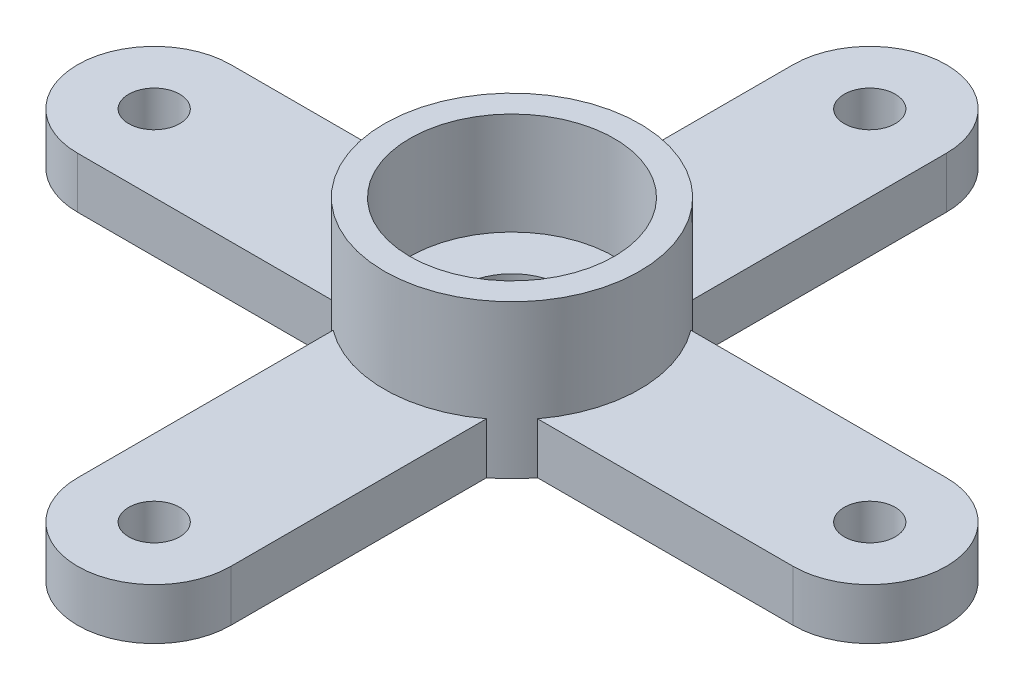
ISO-10303-21;
HEADER;
FILE_DESCRIPTION(('STEP AP214'),'2;1');
FILE_NAME('part.step','',(''),(''),'','','');
FILE_SCHEMA(('AUTOMOTIVE_DESIGN { 1 0 10303 214 1 1 1 1 }'));
ENDSEC;
DATA;
#1=APPLICATION_CONTEXT('core data for automotive mechanical design processes');
#2=APPLICATION_PROTOCOL_DEFINITION('international standard','automotive_design',2000,#1);
#3=PRODUCT_CONTEXT('',#1,'mechanical');
#4=PRODUCT('Part','Part','',(#3));
#5=PRODUCT_RELATED_PRODUCT_CATEGORY('part','',(#4));
#6=PRODUCT_DEFINITION_FORMATION('','',#4);
#7=PRODUCT_DEFINITION_CONTEXT('part definition',#1,'design');
#8=PRODUCT_DEFINITION('design','',#6,#7);
#9=PRODUCT_DEFINITION_SHAPE('','',#8);
#10=(LENGTH_UNIT() NAMED_UNIT(*) SI_UNIT(.MILLI.,.METRE.));
#11=(NAMED_UNIT(*) PLANE_ANGLE_UNIT() SI_UNIT($,.RADIAN.));
#12=(NAMED_UNIT(*) SI_UNIT($,.STERADIAN.) SOLID_ANGLE_UNIT());
#13=UNCERTAINTY_MEASURE_WITH_UNIT(LENGTH_MEASURE(1.E-05),#10,'distance_accuracy_value','');
#14=(GEOMETRIC_REPRESENTATION_CONTEXT(3) GLOBAL_UNCERTAINTY_ASSIGNED_CONTEXT((#13)) GLOBAL_UNIT_ASSIGNED_CONTEXT((#10,
#11,#12)) REPRESENTATION_CONTEXT('',''));
#15=CARTESIAN_POINT('',(0.,0.,0.));
#16=DIRECTION('',(0.,0.,1.));
#17=DIRECTION('',(1.,0.,0.));
#18=AXIS2_PLACEMENT_3D('',#15,#16,#17);
#19=CARTESIAN_POINT('',(0.,1.,0.));
#20=DIRECTION('',(0.,1.,0.));
#21=DIRECTION('',(0.,0.,1.));
#22=AXIS2_PLACEMENT_3D('',#19,#20,#21);
#23=PLANE('',#22);
#24=CARTESIAN_POINT('',(-6.99999999999975,1.,3.38694649705886E-13));
#25=DIRECTION('',(0.,1.,0.));
#26=DIRECTION('',(0.,0.,1.));
#27=AXIS2_PLACEMENT_3D('',#24,#25,#26);
#28=CIRCLE('',#27,0.500000000000129);
#29=CARTESIAN_POINT('',(-6.99999999999975,1.,0.500000000000468));
#30=VERTEX_POINT('',#29);
#31=EDGE_CURVE('E190',#30,#30,#28,.T.);
#32=ORIENTED_EDGE('',*,*,#31,.F.);
#33=EDGE_LOOP('',(#32));
#34=FACE_BOUND('',#33,.T.);
#35=DIRECTION('',(1.,0.,0.));
#36=VECTOR('',#35,1.);
#37=CARTESIAN_POINT('',(0.,1.,1.50000000000034));
#38=LINE('',#37,#36);
#39=CARTESIAN_POINT('',(-6.99999999999975,1.,1.5000000000004));
#40=VERTEX_POINT('',#39);
#41=CARTESIAN_POINT('',(-1.99999999999975,1.,1.50000000000034));
#42=VERTEX_POINT('',#41);
#43=EDGE_CURVE('E316',#40,#42,#38,.T.);
#44=ORIENTED_EDGE('',*,*,#43,.T.);
#45=CARTESIAN_POINT('',(0.,1.,0.));
#46=DIRECTION('',(0.,1.,0.));
#47=DIRECTION('',(0.,0.,1.));
#48=AXIS2_PLACEMENT_3D('',#45,#46,#47);
#49=CIRCLE('',#48,2.5);
#50=CARTESIAN_POINT('',(-2.00000000000007,1.,-1.49999999999991));
#51=VERTEX_POINT('',#50);
#52=EDGE_CURVE('E204',#42,#51,#49,.F.);
#53=ORIENTED_EDGE('',*,*,#52,.T.);
#54=DIRECTION('',(-1.,0.,0.));
#55=VECTOR('',#54,1.);
#56=CARTESIAN_POINT('',(0.,1.,-1.49999999999966));
#57=LINE('',#56,#55);
#58=CARTESIAN_POINT('',(-6.99999999999975,1.,-1.49999999999973));
#59=VERTEX_POINT('',#58);
#60=EDGE_CURVE('E308',#51,#59,#57,.T.);
#61=ORIENTED_EDGE('',*,*,#60,.T.);
#62=CARTESIAN_POINT('',(-6.99999999999975,1.,3.38694649705886E-13));
#63=DIRECTION('',(0.,1.,0.));
#64=DIRECTION('',(0.,0.,1.));
#65=AXIS2_PLACEMENT_3D('',#62,#63,#64);
#66=CIRCLE('',#65,1.50000000000013);
#67=EDGE_CURVE('E310',#59,#40,#66,.T.);
#68=ORIENTED_EDGE('',*,*,#67,.T.);
#69=EDGE_LOOP('',(#44,#53,#61,#68));
#70=FACE_BOUND('',#69,.T.);
#71=ADVANCED_FACE('F41',(#34,#70),#23,.T.);
#72=CARTESIAN_POINT('',(0.,1.,-6.9999999999997));
#73=DIRECTION('',(0.,1.,0.));
#74=DIRECTION('',(0.,0.,1.));
#75=AXIS2_PLACEMENT_3D('',#72,#73,#74);
#76=CIRCLE('',#75,0.50000000000025);
#77=CARTESIAN_POINT('',(0.,1.,-6.49999999999945));
#78=VERTEX_POINT('',#77);
#79=EDGE_CURVE('E184',#78,#78,#76,.T.);
#80=ORIENTED_EDGE('',*,*,#79,.F.);
#81=EDGE_LOOP('',(#80));
#82=FACE_BOUND('',#81,.T.);
#83=DIRECTION('',(0.,0.,1.));
#84=VECTOR('',#83,1.);
#85=CARTESIAN_POINT('',(-1.50000000000004,1.,0.));
#86=LINE('',#85,#84);
#87=CARTESIAN_POINT('',(-1.50000000000017,1.,-6.9999999999997));
#88=VERTEX_POINT('',#87);
#89=CARTESIAN_POINT('',(-1.50000000000017,1.,-1.99999999999987));
#90=VERTEX_POINT('',#89);
#91=EDGE_CURVE('E306',#88,#90,#86,.T.);
#92=ORIENTED_EDGE('',*,*,#91,.T.);
#93=CARTESIAN_POINT('',(1.49999999999996,1.,-2.00000000000003));
#94=VERTEX_POINT('',#93);
#95=EDGE_CURVE('E298',#90,#94,#49,.F.);
#96=ORIENTED_EDGE('',*,*,#95,.T.);
#97=DIRECTION('',(0.,0.,-1.));
#98=VECTOR('',#97,1.);
#99=CARTESIAN_POINT('',(1.49999999999996,1.,0.));
#100=LINE('',#99,#98);
#101=CARTESIAN_POINT('',(1.50000000000008,1.,-6.9999999999997));
#102=VERTEX_POINT('',#101);
#103=EDGE_CURVE('E243',#94,#102,#100,.T.);
#104=ORIENTED_EDGE('',*,*,#103,.T.);
#105=CARTESIAN_POINT('',(0.,1.,-6.9999999999997));
#106=DIRECTION('',(0.,1.,0.));
#107=DIRECTION('',(0.,0.,1.));
#108=AXIS2_PLACEMENT_3D('',#105,#106,#107);
#109=CIRCLE('',#108,1.50000000000025);
#110=EDGE_CURVE('E129',#102,#88,#109,.T.);
#111=ORIENTED_EDGE('',*,*,#110,.T.);
#112=EDGE_LOOP('',(#92,#96,#104,#111));
#113=FACE_BOUND('',#112,.T.);
#114=ADVANCED_FACE('F307',(#82,#113),#23,.T.);
#115=CARTESIAN_POINT('',(7.,1.,0.));
#116=DIRECTION('',(0.,1.,0.));
#117=DIRECTION('',(0.,0.,1.));
#118=AXIS2_PLACEMENT_3D('',#115,#116,#117);
#119=CIRCLE('',#118,0.500000000000001);
#120=CARTESIAN_POINT('',(7.,1.,0.500000000000001));
#121=VERTEX_POINT('',#120);
#122=EDGE_CURVE('E196',#121,#121,#119,.T.);
#123=ORIENTED_EDGE('',*,*,#122,.F.);
#124=EDGE_LOOP('',(#123));
#125=FACE_BOUND('',#124,.T.);
#126=DIRECTION('',(-1.,0.,0.));
#127=VECTOR('',#126,1.);
#128=CARTESIAN_POINT('',(0.,1.,-1.5));
#129=LINE('',#128,#127);
#130=CARTESIAN_POINT('',(7.,1.,-1.5));
#131=VERTEX_POINT('',#130);
#132=CARTESIAN_POINT('',(2.,1.,-1.5));
#133=VERTEX_POINT('',#132);
#134=EDGE_CURVE('E182',#131,#133,#129,.T.);
#135=ORIENTED_EDGE('',*,*,#134,.T.);
#136=CARTESIAN_POINT('',(2.,1.,1.5));
#137=VERTEX_POINT('',#136);
#138=EDGE_CURVE('E304',#133,#137,#49,.F.);
#139=ORIENTED_EDGE('',*,*,#138,.T.);
#140=DIRECTION('',(1.,0.,0.));
#141=VECTOR('',#140,1.);
#142=CARTESIAN_POINT('',(0.,1.,1.5));
#143=LINE('',#142,#141);
#144=CARTESIAN_POINT('',(7.,1.,1.5));
#145=VERTEX_POINT('',#144);
#146=EDGE_CURVE('E176',#137,#145,#143,.T.);
#147=ORIENTED_EDGE('',*,*,#146,.T.);
#148=CARTESIAN_POINT('',(7.,1.,0.));
#149=DIRECTION('',(0.,1.,0.));
#150=DIRECTION('',(0.,0.,1.));
#151=AXIS2_PLACEMENT_3D('',#148,#149,#150);
#152=CIRCLE('',#151,1.5);
#153=EDGE_CURVE('E59',#145,#131,#152,.T.);
#154=ORIENTED_EDGE('',*,*,#153,.T.);
#155=EDGE_LOOP('',(#135,#139,#147,#154));
#156=FACE_BOUND('',#155,.T.);
#157=ADVANCED_FACE('F348',(#125,#156),#23,.T.);
#158=CARTESIAN_POINT('',(0.,1.,0.));
#159=DIRECTION('',(0.,1.,0.));
#160=DIRECTION('',(0.,0.,1.));
#161=AXIS2_PLACEMENT_3D('',#158,#159,#160);
#162=CIRCLE('',#161,1.);
#163=CARTESIAN_POINT('',(0.,1.,1.));
#164=VERTEX_POINT('',#163);
#165=EDGE_CURVE('E187',#164,#164,#162,.T.);
#166=ORIENTED_EDGE('',*,*,#165,.F.);
#167=EDGE_LOOP('',(#166));
#168=FACE_BOUND('',#167,.T.);
#169=CARTESIAN_POINT('',(0.,1.,0.));
#170=DIRECTION('',(0.,1.,0.));
#171=DIRECTION('',(0.,0.,1.));
#172=AXIS2_PLACEMENT_3D('',#169,#170,#171);
#173=CIRCLE('',#172,2.);
#174=CARTESIAN_POINT('',(0.,1.,2.));
#175=VERTEX_POINT('',#174);
#176=EDGE_CURVE('E12',#175,#175,#173,.F.);
#177=ORIENTED_EDGE('',*,*,#176,.F.);
#178=EDGE_LOOP('',(#177));
#179=FACE_BOUND('',#178,.T.);
#180=ADVANCED_FACE('F387',(#168,#179),#23,.T.);
#181=CARTESIAN_POINT('',(1.49999999999996,1.,0.));
#182=DIRECTION('',(-1.,0.,0.));
#183=DIRECTION('',(0.,0.,1.));
#184=AXIS2_PLACEMENT_3D('',#181,#182,#183);
#185=PLANE('',#184);
#186=DIRECTION('',(0.,0.,-1.));
#187=VECTOR('',#186,1.);
#188=CARTESIAN_POINT('',(1.49999999999996,0.,0.));
#189=LINE('',#188,#187);
#190=CARTESIAN_POINT('',(1.50000000000004,0.,-1.99999999999981));
#191=VERTEX_POINT('',#190);
#192=CARTESIAN_POINT('',(1.50000000000008,0.,-6.9999999999997));
#193=VERTEX_POINT('',#192);
#194=EDGE_CURVE('E200',#191,#193,#189,.T.);
#195=ORIENTED_EDGE('',*,*,#194,.T.);
#196=DIRECTION('',(0.,-1.,0.));
#197=VECTOR('',#196,1.);
#198=CARTESIAN_POINT('',(1.50000000000008,1.,-6.9999999999997));
#199=LINE('',#198,#197);
#200=EDGE_CURVE('E45',#102,#193,#199,.T.);
#201=ORIENTED_EDGE('',*,*,#200,.F.);
#202=ORIENTED_EDGE('',*,*,#103,.F.);
#203=DIRECTION('',(0.,-1.,0.));
#204=VECTOR('',#203,1.);
#205=CARTESIAN_POINT('',(1.50000000000004,1.,-1.99999999999981));
#206=LINE('',#205,#204);
#207=EDGE_CURVE('E199',#94,#191,#206,.T.);
#208=ORIENTED_EDGE('',*,*,#207,.T.);
#209=EDGE_LOOP('',(#195,#201,#202,#208));
#210=FACE_BOUND('',#209,.T.);
#211=ADVANCED_FACE('F43',(#210),#185,.F.);
#212=CARTESIAN_POINT('',(0.,1.,-6.9999999999997));
#213=DIRECTION('',(0.,-1.,0.));
#214=DIRECTION('',(0.,0.,-1.));
#215=AXIS2_PLACEMENT_3D('',#212,#213,#214);
#216=CYLINDRICAL_SURFACE('',#215,1.50000000000025);
#217=CARTESIAN_POINT('',(0.,0.,-6.9999999999997));
#218=DIRECTION('',(0.,1.,0.));
#219=DIRECTION('',(0.,0.,1.));
#220=AXIS2_PLACEMENT_3D('',#217,#218,#219);
#221=CIRCLE('',#220,1.50000000000025);
#222=CARTESIAN_POINT('',(-1.50000000000017,0.,-6.9999999999997));
#223=VERTEX_POINT('',#222);
#224=EDGE_CURVE('E203',#193,#223,#221,.T.);
#225=ORIENTED_EDGE('',*,*,#224,.T.);
#226=DIRECTION('',(0.,-1.,0.));
#227=VECTOR('',#226,1.);
#228=CARTESIAN_POINT('',(-1.50000000000017,1.,-6.9999999999997));
#229=LINE('',#228,#227);
#230=EDGE_CURVE('E274',#88,#223,#229,.T.);
#231=ORIENTED_EDGE('',*,*,#230,.F.);
#232=ORIENTED_EDGE('',*,*,#110,.F.);
#233=ORIENTED_EDGE('',*,*,#200,.T.);
#234=EDGE_LOOP('',(#225,#231,#232,#233));
#235=FACE_BOUND('',#234,.T.);
#236=ADVANCED_FACE('F280',(#235),#216,.T.);
#237=CARTESIAN_POINT('',(-1.50000000000004,1.,0.));
#238=DIRECTION('',(1.,0.,0.));
#239=DIRECTION('',(0.,0.,-1.));
#240=AXIS2_PLACEMENT_3D('',#237,#238,#239);
#241=PLANE('',#240);
#242=DIRECTION('',(0.,0.,1.));
#243=VECTOR('',#242,1.);
#244=CARTESIAN_POINT('',(-1.50000000000004,0.,0.));
#245=LINE('',#244,#243);
#246=CARTESIAN_POINT('',(-1.50000000000011,0.,-1.99999999999979));
#247=VERTEX_POINT('',#246);
#248=EDGE_CURVE('E206',#223,#247,#245,.T.);
#249=ORIENTED_EDGE('',*,*,#248,.T.);
#250=DIRECTION('',(0.,-1.,0.));
#251=VECTOR('',#250,1.);
#252=CARTESIAN_POINT('',(-1.50000000000011,1.,-1.99999999999979));
#253=LINE('',#252,#251);
#254=EDGE_CURVE('E272',#90,#247,#253,.T.);
#255=ORIENTED_EDGE('',*,*,#254,.F.);
#256=ORIENTED_EDGE('',*,*,#91,.F.);
#257=ORIENTED_EDGE('',*,*,#230,.T.);
#258=EDGE_LOOP('',(#249,#255,#256,#257));
#259=FACE_BOUND('',#258,.T.);
#260=ADVANCED_FACE('F291',(#259),#241,.F.);
#261=CARTESIAN_POINT('',(0.,1.,-1.49999999999966));
#262=DIRECTION('',(0.,0.,1.));
#263=DIRECTION('',(1.,0.,0.));
#264=AXIS2_PLACEMENT_3D('',#261,#262,#263);
#265=PLANE('',#264);
#266=DIRECTION('',(-1.,0.,0.));
#267=VECTOR('',#266,1.);
#268=CARTESIAN_POINT('',(0.,0.,-1.49999999999966));
#269=LINE('',#268,#267);
#270=CARTESIAN_POINT('',(-1.99999999999991,0.,-1.49999999999978));
#271=VERTEX_POINT('',#270);
#272=CARTESIAN_POINT('',(-6.99999999999975,0.,-1.49999999999973));
#273=VERTEX_POINT('',#272);
#274=EDGE_CURVE('E210',#271,#273,#269,.T.);
#275=ORIENTED_EDGE('',*,*,#274,.T.);
#276=DIRECTION('',(0.,-1.,0.));
#277=VECTOR('',#276,1.);
#278=CARTESIAN_POINT('',(-6.99999999999975,1.,-1.49999999999973));
#279=LINE('',#278,#277);
#280=EDGE_CURVE('E266',#59,#273,#279,.T.);
#281=ORIENTED_EDGE('',*,*,#280,.F.);
#282=ORIENTED_EDGE('',*,*,#60,.F.);
#283=DIRECTION('',(0.,-1.,0.));
#284=VECTOR('',#283,1.);
#285=CARTESIAN_POINT('',(-1.99999999999991,1.,-1.49999999999978));
#286=LINE('',#285,#284);
#287=EDGE_CURVE('E269',#51,#271,#286,.T.);
#288=ORIENTED_EDGE('',*,*,#287,.T.);
#289=EDGE_LOOP('',(#275,#281,#282,#288));
#290=FACE_BOUND('',#289,.T.);
#291=ADVANCED_FACE('F453',(#290),#265,.F.);
#292=CARTESIAN_POINT('',(-6.99999999999975,1.,3.38694649705886E-13));
#293=DIRECTION('',(0.,-1.,0.));
#294=DIRECTION('',(0.,0.,-1.));
#295=AXIS2_PLACEMENT_3D('',#292,#293,#294);
#296=CYLINDRICAL_SURFACE('',#295,1.50000000000013);
#297=CARTESIAN_POINT('',(-6.99999999999975,0.,3.38694649705886E-13));
#298=DIRECTION('',(0.,1.,0.));
#299=DIRECTION('',(0.,0.,1.));
#300=AXIS2_PLACEMENT_3D('',#297,#298,#299);
#301=CIRCLE('',#300,1.50000000000013);
#302=CARTESIAN_POINT('',(-6.99999999999975,0.,1.5000000000004));
#303=VERTEX_POINT('',#302);
#304=EDGE_CURVE('E213',#273,#303,#301,.T.);
#305=ORIENTED_EDGE('',*,*,#304,.T.);
#306=DIRECTION('',(0.,-1.,0.));
#307=VECTOR('',#306,1.);
#308=CARTESIAN_POINT('',(-6.99999999999975,1.,1.5000000000004));
#309=LINE('',#308,#307);
#310=EDGE_CURVE('E263',#40,#303,#309,.T.);
#311=ORIENTED_EDGE('',*,*,#310,.F.);
#312=ORIENTED_EDGE('',*,*,#67,.F.);
#313=ORIENTED_EDGE('',*,*,#280,.T.);
#314=EDGE_LOOP('',(#305,#311,#312,#313));
#315=FACE_BOUND('',#314,.T.);
#316=ADVANCED_FACE('F450',(#315),#296,.T.);
#317=CARTESIAN_POINT('',(0.,1.,1.50000000000034));
#318=DIRECTION('',(0.,0.,-1.));
#319=DIRECTION('',(-1.,0.,0.));
#320=AXIS2_PLACEMENT_3D('',#317,#318,#319);
#321=PLANE('',#320);
#322=DIRECTION('',(1.,0.,0.));
#323=VECTOR('',#322,1.);
#324=CARTESIAN_POINT('',(0.,0.,1.50000000000034));
#325=LINE('',#324,#323);
#326=CARTESIAN_POINT('',(-1.99999999999975,0.,1.50000000000034));
#327=VERTEX_POINT('',#326);
#328=EDGE_CURVE('E215',#303,#327,#325,.T.);
#329=ORIENTED_EDGE('',*,*,#328,.T.);
#330=DIRECTION('',(0.,-1.,0.));
#331=VECTOR('',#330,1.);
#332=CARTESIAN_POINT('',(-1.99999999999975,1.,1.50000000000034));
#333=LINE('',#332,#331);
#334=EDGE_CURVE('E260',#42,#327,#333,.T.);
#335=ORIENTED_EDGE('',*,*,#334,.F.);
#336=ORIENTED_EDGE('',*,*,#43,.F.);
#337=ORIENTED_EDGE('',*,*,#310,.T.);
#338=EDGE_LOOP('',(#329,#335,#336,#337));
#339=FACE_BOUND('',#338,.T.);
#340=ADVANCED_FACE('F326',(#339),#321,.F.);
#341=CARTESIAN_POINT('',(-1.4999999999997,1.,0.));
#342=DIRECTION('',(1.,0.,0.));
#343=DIRECTION('',(0.,0.,-1.));
#344=AXIS2_PLACEMENT_3D('',#341,#342,#343);
#345=PLANE('',#344);
#346=DIRECTION('',(0.,0.,1.));
#347=VECTOR('',#346,1.);
#348=CARTESIAN_POINT('',(-1.4999999999997,0.,0.));
#349=LINE('',#348,#347);
#350=CARTESIAN_POINT('',(-1.49999999999975,0.,2.0000000000001));
#351=VERTEX_POINT('',#350);
#352=CARTESIAN_POINT('',(-1.49999999999964,0.,7.00000000000004));
#353=VERTEX_POINT('',#352);
#354=EDGE_CURVE('E217',#351,#353,#349,.T.);
#355=ORIENTED_EDGE('',*,*,#354,.T.);
#356=DIRECTION('',(0.,-1.,0.));
#357=VECTOR('',#356,1.);
#358=CARTESIAN_POINT('',(-1.49999999999964,1.,7.00000000000004));
#359=LINE('',#358,#357);
#360=CARTESIAN_POINT('',(-1.49999999999964,1.,7.00000000000004));
#361=VERTEX_POINT('',#360);
#362=EDGE_CURVE('E171',#361,#353,#359,.T.);
#363=ORIENTED_EDGE('',*,*,#362,.F.);
#364=DIRECTION('',(0.,0.,1.));
#365=VECTOR('',#364,1.);
#366=CARTESIAN_POINT('',(-1.4999999999997,1.,0.));
#367=LINE('',#366,#365);
#368=CARTESIAN_POINT('',(-1.49999999999975,1.,2.0000000000001));
#369=VERTEX_POINT('',#368);
#370=EDGE_CURVE('E159',#369,#361,#367,.T.);
#371=ORIENTED_EDGE('',*,*,#370,.F.);
#372=DIRECTION('',(0.,-1.,0.));
#373=VECTOR('',#372,1.);
#374=CARTESIAN_POINT('',(-1.49999999999975,1.,2.0000000000001));
#375=LINE('',#374,#373);
#376=EDGE_CURVE('E257',#369,#351,#375,.T.);
#377=ORIENTED_EDGE('',*,*,#376,.T.);
#378=EDGE_LOOP('',(#355,#363,#371,#377));
#379=FACE_BOUND('',#378,.T.);
#380=ADVANCED_FACE('F444',(#379),#345,.F.);
#381=CARTESIAN_POINT('',(2.9598213859925E-13,1.,7.00000000000004));
#382=DIRECTION('',(0.,-1.,0.));
#383=DIRECTION('',(0.,0.,-1.));
#384=AXIS2_PLACEMENT_3D('',#381,#382,#383);
#385=CYLINDRICAL_SURFACE('',#384,1.49999999999987);
#386=CARTESIAN_POINT('',(2.9598213859925E-13,0.,7.00000000000004));
#387=DIRECTION('',(0.,1.,0.));
#388=DIRECTION('',(0.,0.,1.));
#389=AXIS2_PLACEMENT_3D('',#386,#387,#388);
#390=CIRCLE('',#389,1.49999999999987);
#391=CARTESIAN_POINT('',(1.50000000000023,0.,7.00000000000004));
#392=VERTEX_POINT('',#391);
#393=EDGE_CURVE('E168',#353,#392,#390,.T.);
#394=ORIENTED_EDGE('',*,*,#393,.T.);
#395=DIRECTION('',(0.,-1.,0.));
#396=VECTOR('',#395,1.);
#397=CARTESIAN_POINT('',(1.50000000000023,1.,7.00000000000004));
#398=LINE('',#397,#396);
#399=CARTESIAN_POINT('',(1.50000000000023,1.,7.00000000000004));
#400=VERTEX_POINT('',#399);
#401=EDGE_CURVE('E165',#400,#392,#398,.T.);
#402=ORIENTED_EDGE('',*,*,#401,.F.);
#403=CARTESIAN_POINT('',(2.9598213859925E-13,1.,7.00000000000004));
#404=DIRECTION('',(0.,1.,0.));
#405=DIRECTION('',(0.,0.,1.));
#406=AXIS2_PLACEMENT_3D('',#403,#404,#405);
#407=CIRCLE('',#406,1.49999999999987);
#408=EDGE_CURVE('E150',#361,#400,#407,.T.);
#409=ORIENTED_EDGE('',*,*,#408,.F.);
#410=ORIENTED_EDGE('',*,*,#362,.T.);
#411=EDGE_LOOP('',(#394,#402,#409,#410));
#412=FACE_BOUND('',#411,.T.);
#413=ADVANCED_FACE('F166',(#412),#385,.T.);
#414=CARTESIAN_POINT('',(1.5000000000003,1.,0.));
#415=DIRECTION('',(-1.,0.,0.));
#416=DIRECTION('',(0.,0.,1.));
#417=AXIS2_PLACEMENT_3D('',#414,#415,#416);
#418=PLANE('',#417);
#419=DIRECTION('',(0.,0.,-1.));
#420=VECTOR('',#419,1.);
#421=CARTESIAN_POINT('',(1.5000000000003,0.,0.));
#422=LINE('',#421,#420);
#423=CARTESIAN_POINT('',(1.50000000000023,0.,1.99999999999996));
#424=VERTEX_POINT('',#423);
#425=EDGE_CURVE('E220',#392,#424,#422,.T.);
#426=ORIENTED_EDGE('',*,*,#425,.T.);
#427=DIRECTION('',(0.,-1.,0.));
#428=VECTOR('',#427,1.);
#429=CARTESIAN_POINT('',(1.50000000000023,1.,1.99999999999996));
#430=LINE('',#429,#428);
#431=CARTESIAN_POINT('',(1.5000000000003,1.,1.99999999999978));
#432=VERTEX_POINT('',#431);
#433=EDGE_CURVE('E172',#432,#424,#430,.T.);
#434=ORIENTED_EDGE('',*,*,#433,.F.);
#435=DIRECTION('',(0.,0.,-1.));
#436=VECTOR('',#435,1.);
#437=CARTESIAN_POINT('',(1.5000000000003,1.,0.));
#438=LINE('',#437,#436);
#439=EDGE_CURVE('E156',#400,#432,#438,.T.);
#440=ORIENTED_EDGE('',*,*,#439,.F.);
#441=ORIENTED_EDGE('',*,*,#401,.T.);
#442=EDGE_LOOP('',(#426,#434,#440,#441));
#443=FACE_BOUND('',#442,.T.);
#444=ADVANCED_FACE('F174',(#443),#418,.F.);
#445=CARTESIAN_POINT('',(0.,1.,1.5));
#446=DIRECTION('',(0.,0.,-1.));
#447=DIRECTION('',(-1.,0.,0.));
#448=AXIS2_PLACEMENT_3D('',#445,#446,#447);
#449=PLANE('',#448);
#450=DIRECTION('',(1.,0.,0.));
#451=VECTOR('',#450,1.);
#452=CARTESIAN_POINT('',(0.,0.,1.5));
#453=LINE('',#452,#451);
#454=CARTESIAN_POINT('',(2.,0.,1.5));
#455=VERTEX_POINT('',#454);
#456=CARTESIAN_POINT('',(7.,0.,1.5));
#457=VERTEX_POINT('',#456);
#458=EDGE_CURVE('E223',#455,#457,#453,.T.);
#459=ORIENTED_EDGE('',*,*,#458,.T.);
#460=DIRECTION('',(0.,-1.,0.));
#461=VECTOR('',#460,1.);
#462=CARTESIAN_POINT('',(7.,1.,1.5));
#463=LINE('',#462,#461);
#464=EDGE_CURVE('E249',#145,#457,#463,.T.);
#465=ORIENTED_EDGE('',*,*,#464,.F.);
#466=ORIENTED_EDGE('',*,*,#146,.F.);
#467=DIRECTION('',(0.,-1.,0.));
#468=VECTOR('',#467,1.);
#469=CARTESIAN_POINT('',(2.,1.,1.5));
#470=LINE('',#469,#468);
#471=EDGE_CURVE('E252',#137,#455,#470,.T.);
#472=ORIENTED_EDGE('',*,*,#471,.T.);
#473=EDGE_LOOP('',(#459,#465,#466,#472));
#474=FACE_BOUND('',#473,.T.);
#475=ADVANCED_FACE('F339',(#474),#449,.F.);
#476=CARTESIAN_POINT('',(7.,1.,0.));
#477=DIRECTION('',(0.,-1.,0.));
#478=DIRECTION('',(0.,0.,-1.));
#479=AXIS2_PLACEMENT_3D('',#476,#477,#478);
#480=CYLINDRICAL_SURFACE('',#479,1.5);
#481=CARTESIAN_POINT('',(7.,0.,0.));
#482=DIRECTION('',(0.,1.,0.));
#483=DIRECTION('',(0.,0.,1.));
#484=AXIS2_PLACEMENT_3D('',#481,#482,#483);
#485=CIRCLE('',#484,1.5);
#486=CARTESIAN_POINT('',(7.,0.,-1.5));
#487=VERTEX_POINT('',#486);
#488=EDGE_CURVE('E225',#457,#487,#485,.T.);
#489=ORIENTED_EDGE('',*,*,#488,.T.);
#490=DIRECTION('',(0.,-1.,0.));
#491=VECTOR('',#490,1.);
#492=CARTESIAN_POINT('',(7.,1.,-1.5));
#493=LINE('',#492,#491);
#494=EDGE_CURVE('E247',#131,#487,#493,.T.);
#495=ORIENTED_EDGE('',*,*,#494,.F.);
#496=ORIENTED_EDGE('',*,*,#153,.F.);
#497=ORIENTED_EDGE('',*,*,#464,.T.);
#498=EDGE_LOOP('',(#489,#495,#496,#497));
#499=FACE_BOUND('',#498,.T.);
#500=ADVANCED_FACE('F343',(#499),#480,.T.);
#501=CARTESIAN_POINT('',(0.,1.,-1.5));
#502=DIRECTION('',(0.,0.,1.));
#503=DIRECTION('',(1.,0.,0.));
#504=AXIS2_PLACEMENT_3D('',#501,#502,#503);
#505=PLANE('',#504);
#506=DIRECTION('',(-1.,0.,0.));
#507=VECTOR('',#506,1.);
#508=CARTESIAN_POINT('',(0.,0.,-1.5));
#509=LINE('',#508,#507);
#510=CARTESIAN_POINT('',(2.,0.,-1.5));
#511=VERTEX_POINT('',#510);
#512=EDGE_CURVE('E113',#487,#511,#509,.T.);
#513=ORIENTED_EDGE('',*,*,#512,.T.);
#514=DIRECTION('',(0.,-1.,0.));
#515=VECTOR('',#514,1.);
#516=CARTESIAN_POINT('',(2.,1.,-1.5));
#517=LINE('',#516,#515);
#518=EDGE_CURVE('E245',#133,#511,#517,.T.);
#519=ORIENTED_EDGE('',*,*,#518,.F.);
#520=ORIENTED_EDGE('',*,*,#134,.F.);
#521=ORIENTED_EDGE('',*,*,#494,.T.);
#522=EDGE_LOOP('',(#513,#519,#520,#521));
#523=FACE_BOUND('',#522,.T.);
#524=ADVANCED_FACE('F345',(#523),#505,.F.);
#525=CARTESIAN_POINT('',(2.9598213859925E-13,1.,7.00000000000004));
#526=DIRECTION('',(0.,-1.,0.));
#527=DIRECTION('',(0.,0.,-1.));
#528=AXIS2_PLACEMENT_3D('',#525,#526,#527);
#529=CYLINDRICAL_SURFACE('',#528,0.499999999999867);
#530=CARTESIAN_POINT('',(2.9598213859925E-13,1.,7.00000000000004));
#531=DIRECTION('',(0.,1.,0.));
#532=DIRECTION('',(0.,0.,1.));
#533=AXIS2_PLACEMENT_3D('',#530,#531,#532);
#534=CIRCLE('',#533,0.499999999999867);
#535=CARTESIAN_POINT('',(2.9598213859925E-13,1.,7.49999999999991));
#536=VERTEX_POINT('',#535);
#537=EDGE_CURVE('E193',#536,#536,#534,.T.);
#538=ORIENTED_EDGE('',*,*,#537,.T.);
#539=EDGE_LOOP('',(#538));
#540=FACE_BOUND('',#539,.T.);
#541=CARTESIAN_POINT('',(2.9598213859925E-13,0.,7.00000000000004));
#542=DIRECTION('',(0.,1.,0.));
#543=DIRECTION('',(0.,0.,1.));
#544=AXIS2_PLACEMENT_3D('',#541,#542,#543);
#545=CIRCLE('',#544,0.499999999999867);
#546=CARTESIAN_POINT('',(2.9598213859925E-13,0.,7.49999999999991));
#547=VERTEX_POINT('',#546);
#548=EDGE_CURVE('E237',#547,#547,#545,.T.);
#549=ORIENTED_EDGE('',*,*,#548,.F.);
#550=EDGE_LOOP('',(#549));
#551=FACE_BOUND('',#550,.T.);
#552=ADVANCED_FACE('F421',(#540,#551),#529,.F.);
#553=CARTESIAN_POINT('',(-6.99999999999975,1.,3.38694649705886E-13));
#554=DIRECTION('',(0.,-1.,0.));
#555=DIRECTION('',(0.,0.,-1.));
#556=AXIS2_PLACEMENT_3D('',#553,#554,#555);
#557=CYLINDRICAL_SURFACE('',#556,0.500000000000129);
#558=ORIENTED_EDGE('',*,*,#31,.T.);
#559=EDGE_LOOP('',(#558));
#560=FACE_BOUND('',#559,.T.);
#561=CARTESIAN_POINT('',(-6.99999999999975,0.,3.38694649705886E-13));
#562=DIRECTION('',(0.,1.,0.));
#563=DIRECTION('',(0.,0.,1.));
#564=AXIS2_PLACEMENT_3D('',#561,#562,#563);
#565=CIRCLE('',#564,0.500000000000129);
#566=CARTESIAN_POINT('',(-6.99999999999975,0.,0.500000000000468));
#567=VERTEX_POINT('',#566);
#568=EDGE_CURVE('E234',#567,#567,#565,.T.);
#569=ORIENTED_EDGE('',*,*,#568,.F.);
#570=EDGE_LOOP('',(#569));
#571=FACE_BOUND('',#570,.T.);
#572=ADVANCED_FACE('F409',(#560,#571),#557,.F.);
#573=CARTESIAN_POINT('',(0.,1.,0.));
#574=DIRECTION('',(0.,-1.,0.));
#575=DIRECTION('',(0.,0.,-1.));
#576=AXIS2_PLACEMENT_3D('',#573,#574,#575);
#577=CYLINDRICAL_SURFACE('',#576,1.);
#578=ORIENTED_EDGE('',*,*,#165,.T.);
#579=EDGE_LOOP('',(#578));
#580=FACE_BOUND('',#579,.T.);
#581=CARTESIAN_POINT('',(0.,0.,0.));
#582=DIRECTION('',(0.,1.,0.));
#583=DIRECTION('',(0.,0.,1.));
#584=AXIS2_PLACEMENT_3D('',#581,#582,#583);
#585=CIRCLE('',#584,1.);
#586=CARTESIAN_POINT('',(0.,0.,1.));
#587=VERTEX_POINT('',#586);
#588=EDGE_CURVE('E231',#587,#587,#585,.T.);
#589=ORIENTED_EDGE('',*,*,#588,.F.);
#590=EDGE_LOOP('',(#589));
#591=FACE_BOUND('',#590,.T.);
#592=ADVANCED_FACE('F405',(#580,#591),#577,.F.);
#593=CARTESIAN_POINT('',(0.,1.,-6.9999999999997));
#594=DIRECTION('',(0.,-1.,0.));
#595=DIRECTION('',(0.,0.,-1.));
#596=AXIS2_PLACEMENT_3D('',#593,#594,#595);
#597=CYLINDRICAL_SURFACE('',#596,0.50000000000025);
#598=ORIENTED_EDGE('',*,*,#79,.T.);
#599=EDGE_LOOP('',(#598));
#600=FACE_BOUND('',#599,.T.);
#601=CARTESIAN_POINT('',(0.,0.,-6.9999999999997));
#602=DIRECTION('',(0.,1.,0.));
#603=DIRECTION('',(0.,0.,1.));
#604=AXIS2_PLACEMENT_3D('',#601,#602,#603);
#605=CIRCLE('',#604,0.50000000000025);
#606=CARTESIAN_POINT('',(0.,0.,-6.49999999999945));
#607=VERTEX_POINT('',#606);
#608=EDGE_CURVE('E228',#607,#607,#605,.T.);
#609=ORIENTED_EDGE('',*,*,#608,.F.);
#610=EDGE_LOOP('',(#609));
#611=FACE_BOUND('',#610,.T.);
#612=ADVANCED_FACE('F408',(#600,#611),#597,.F.);
#613=CARTESIAN_POINT('',(0.,1.,0.));
#614=DIRECTION('',(0.,-1.,0.));
#615=DIRECTION('',(0.,0.,-1.));
#616=AXIS2_PLACEMENT_3D('',#613,#614,#615);
#617=CYLINDRICAL_SURFACE('',#616,2.5);
#618=CARTESIAN_POINT('',(0.,0.,0.));
#619=DIRECTION('',(0.,1.,0.));
#620=DIRECTION('',(0.,0.,1.));
#621=AXIS2_PLACEMENT_3D('',#618,#619,#620);
#622=CIRCLE('',#621,2.5);
#623=EDGE_CURVE('E120',#511,#191,#622,.T.);
#624=ORIENTED_EDGE('',*,*,#623,.T.);
#625=ORIENTED_EDGE('',*,*,#207,.F.);
#626=ORIENTED_EDGE('',*,*,#95,.F.);
#627=ORIENTED_EDGE('',*,*,#254,.T.);
#628=EDGE_CURVE('E208',#247,#271,#622,.T.);
#629=ORIENTED_EDGE('',*,*,#628,.T.);
#630=ORIENTED_EDGE('',*,*,#287,.F.);
#631=ORIENTED_EDGE('',*,*,#52,.F.);
#632=ORIENTED_EDGE('',*,*,#334,.T.);
#633=EDGE_CURVE('E211',#327,#351,#622,.T.);
#634=ORIENTED_EDGE('',*,*,#633,.T.);
#635=ORIENTED_EDGE('',*,*,#376,.F.);
#636=EDGE_CURVE('E353',#432,#369,#49,.F.);
#637=ORIENTED_EDGE('',*,*,#636,.F.);
#638=ORIENTED_EDGE('',*,*,#433,.T.);
#639=EDGE_CURVE('E222',#424,#455,#622,.T.);
#640=ORIENTED_EDGE('',*,*,#639,.T.);
#641=ORIENTED_EDGE('',*,*,#471,.F.);
#642=ORIENTED_EDGE('',*,*,#138,.F.);
#643=ORIENTED_EDGE('',*,*,#518,.T.);
#644=EDGE_LOOP('',(#624,#625,#626,#627,#629,#630,#631,#632,#634,#635,#637,#638,#640,#641,#642,#643));
#645=FACE_BOUND('',#644,.T.);
#646=CARTESIAN_POINT('',(0.,3.,0.));
#647=DIRECTION('',(0.,1.,0.));
#648=DIRECTION('',(0.,0.,1.));
#649=AXIS2_PLACEMENT_3D('',#646,#647,#648);
#650=CIRCLE('',#649,2.5);
#651=CARTESIAN_POINT('',(0.,3.,2.5));
#652=VERTEX_POINT('',#651);
#653=EDGE_CURVE('E354',#652,#652,#650,.T.);
#654=ORIENTED_EDGE('',*,*,#653,.F.);
#655=EDGE_LOOP('',(#654));
#656=FACE_BOUND('',#655,.T.);
#657=ADVANCED_FACE('F294',(#645,#656),#617,.T.);
#658=CARTESIAN_POINT('',(7.,1.,0.));
#659=DIRECTION('',(0.,-1.,0.));
#660=DIRECTION('',(0.,0.,-1.));
#661=AXIS2_PLACEMENT_3D('',#658,#659,#660);
#662=CYLINDRICAL_SURFACE('',#661,0.500000000000001);
#663=ORIENTED_EDGE('',*,*,#122,.T.);
#664=EDGE_LOOP('',(#663));
#665=FACE_BOUND('',#664,.T.);
#666=CARTESIAN_POINT('',(7.,0.,0.));
#667=DIRECTION('',(0.,1.,0.));
#668=DIRECTION('',(0.,0.,1.));
#669=AXIS2_PLACEMENT_3D('',#666,#667,#668);
#670=CIRCLE('',#669,0.500000000000001);
#671=CARTESIAN_POINT('',(7.,0.,0.500000000000001));
#672=VERTEX_POINT('',#671);
#673=EDGE_CURVE('E240',#672,#672,#670,.T.);
#674=ORIENTED_EDGE('',*,*,#673,.F.);
#675=EDGE_LOOP('',(#674));
#676=FACE_BOUND('',#675,.T.);
#677=ADVANCED_FACE('F386',(#665,#676),#662,.F.);
#678=ORIENTED_EDGE('',*,*,#439,.T.);
#679=ORIENTED_EDGE('',*,*,#636,.T.);
#680=ORIENTED_EDGE('',*,*,#370,.T.);
#681=ORIENTED_EDGE('',*,*,#408,.T.);
#682=EDGE_LOOP('',(#678,#679,#680,#681));
#683=FACE_BOUND('',#682,.T.);
#684=ORIENTED_EDGE('',*,*,#537,.F.);
#685=EDGE_LOOP('',(#684));
#686=FACE_BOUND('',#685,.T.);
#687=ADVANCED_FACE('F152',(#683,#686),#23,.T.);
#688=CARTESIAN_POINT('',(0.,0.,0.));
#689=DIRECTION('',(0.,1.,0.));
#690=DIRECTION('',(0.,0.,1.));
#691=AXIS2_PLACEMENT_3D('',#688,#689,#690);
#692=PLANE('',#691);
#693=ORIENTED_EDGE('',*,*,#354,.F.);
#694=ORIENTED_EDGE('',*,*,#633,.F.);
#695=ORIENTED_EDGE('',*,*,#328,.F.);
#696=ORIENTED_EDGE('',*,*,#304,.F.);
#697=ORIENTED_EDGE('',*,*,#274,.F.);
#698=ORIENTED_EDGE('',*,*,#628,.F.);
#699=ORIENTED_EDGE('',*,*,#248,.F.);
#700=ORIENTED_EDGE('',*,*,#224,.F.);
#701=ORIENTED_EDGE('',*,*,#194,.F.);
#702=ORIENTED_EDGE('',*,*,#623,.F.);
#703=ORIENTED_EDGE('',*,*,#512,.F.);
#704=ORIENTED_EDGE('',*,*,#488,.F.);
#705=ORIENTED_EDGE('',*,*,#458,.F.);
#706=ORIENTED_EDGE('',*,*,#639,.F.);
#707=ORIENTED_EDGE('',*,*,#425,.F.);
#708=ORIENTED_EDGE('',*,*,#393,.F.);
#709=EDGE_LOOP('',(#693,#694,#695,#696,#697,#698,#699,#700,#701,#702,#703,#704,#705,#706,#707,#708));
#710=FACE_BOUND('',#709,.T.);
#711=ORIENTED_EDGE('',*,*,#548,.T.);
#712=EDGE_LOOP('',(#711));
#713=FACE_BOUND('',#712,.T.);
#714=ORIENTED_EDGE('',*,*,#588,.T.);
#715=EDGE_LOOP('',(#714));
#716=FACE_BOUND('',#715,.T.);
#717=ORIENTED_EDGE('',*,*,#673,.T.);
#718=EDGE_LOOP('',(#717));
#719=FACE_BOUND('',#718,.T.);
#720=ORIENTED_EDGE('',*,*,#608,.T.);
#721=EDGE_LOOP('',(#720));
#722=FACE_BOUND('',#721,.T.);
#723=ORIENTED_EDGE('',*,*,#568,.T.);
#724=EDGE_LOOP('',(#723));
#725=FACE_BOUND('',#724,.T.);
#726=ADVANCED_FACE('F286',(#710,#713,#716,#719,#722,#725),#692,.F.);
#727=CARTESIAN_POINT('',(0.,3.,0.));
#728=DIRECTION('',(0.,1.,0.));
#729=DIRECTION('',(0.,0.,1.));
#730=AXIS2_PLACEMENT_3D('',#727,#728,#729);
#731=PLANE('',#730);
#732=ORIENTED_EDGE('',*,*,#653,.T.);
#733=EDGE_LOOP('',(#732));
#734=FACE_BOUND('',#733,.T.);
#735=CARTESIAN_POINT('',(0.,3.,0.));
#736=DIRECTION('',(0.,1.,0.));
#737=DIRECTION('',(0.,0.,1.));
#738=AXIS2_PLACEMENT_3D('',#735,#736,#737);
#739=CIRCLE('',#738,2.);
#740=CARTESIAN_POINT('',(0.,3.,2.));
#741=VERTEX_POINT('',#740);
#742=EDGE_CURVE('E356',#741,#741,#739,.T.);
#743=ORIENTED_EDGE('',*,*,#742,.F.);
#744=EDGE_LOOP('',(#743));
#745=FACE_BOUND('',#744,.T.);
#746=ADVANCED_FACE('F364',(#734,#745),#731,.T.);
#747=CARTESIAN_POINT('',(0.,3.,0.));
#748=DIRECTION('',(0.,-1.,0.));
#749=DIRECTION('',(0.,0.,-1.));
#750=AXIS2_PLACEMENT_3D('',#747,#748,#749);
#751=CYLINDRICAL_SURFACE('',#750,2.);
#752=ORIENTED_EDGE('',*,*,#176,.T.);
#753=EDGE_LOOP('',(#752));
#754=FACE_BOUND('',#753,.T.);
#755=ORIENTED_EDGE('',*,*,#742,.T.);
#756=EDGE_LOOP('',(#755));
#757=FACE_BOUND('',#756,.T.);
#758=ADVANCED_FACE('F362',(#754,#757),#751,.F.);
#759=CLOSED_SHELL('',(#71,#114,#157,#180,#211,#236,#260,#291,#316,#340,#380,#413,#444,#475,#500,
#524,#552,#572,#592,#612,#657,#677,#687,#726,#746,#758));
#760=MANIFOLD_SOLID_BREP('B2',#759);
#761=ADVANCED_BREP_SHAPE_REPRESENTATION('',(#18,#760),#14);
#762=SHAPE_DEFINITION_REPRESENTATION(#9,#761);
ENDSEC;
END-ISO-10303-21;
